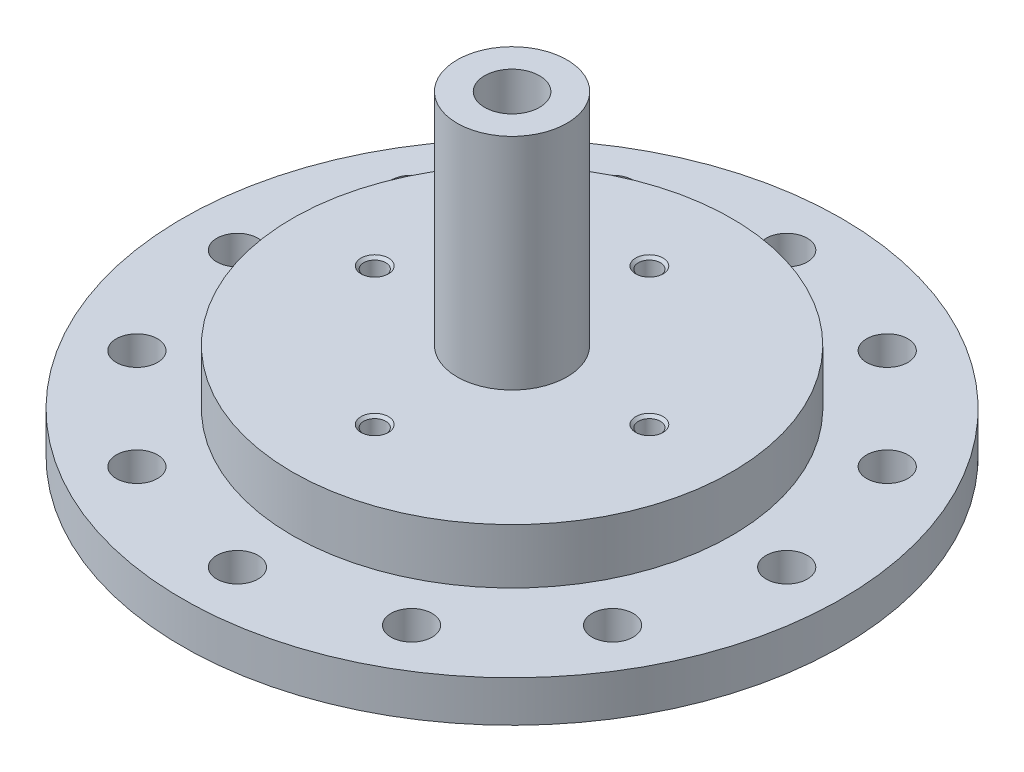
ISO-10303-21;
HEADER;
FILE_DESCRIPTION(('STEP AP214'),'2;1');
FILE_NAME('part.step','',(''),(''),'','','');
FILE_SCHEMA(('AUTOMOTIVE_DESIGN { 1 0 10303 214 1 1 1 1 }'));
ENDSEC;
DATA;
#1=APPLICATION_CONTEXT('core data for automotive mechanical design processes');
#2=APPLICATION_PROTOCOL_DEFINITION('international standard','automotive_design',2000,#1);
#3=PRODUCT_CONTEXT('',#1,'mechanical');
#4=PRODUCT('Part','Part','',(#3));
#5=PRODUCT_RELATED_PRODUCT_CATEGORY('part','',(#4));
#6=PRODUCT_DEFINITION_FORMATION('','',#4);
#7=PRODUCT_DEFINITION_CONTEXT('part definition',#1,'design');
#8=PRODUCT_DEFINITION('design','',#6,#7);
#9=PRODUCT_DEFINITION_SHAPE('','',#8);
#10=(LENGTH_UNIT() NAMED_UNIT(*) SI_UNIT(.MILLI.,.METRE.));
#11=(NAMED_UNIT(*) PLANE_ANGLE_UNIT() SI_UNIT($,.RADIAN.));
#12=(NAMED_UNIT(*) SI_UNIT($,.STERADIAN.) SOLID_ANGLE_UNIT());
#13=UNCERTAINTY_MEASURE_WITH_UNIT(LENGTH_MEASURE(1.E-05),#10,'distance_accuracy_value','');
#14=(GEOMETRIC_REPRESENTATION_CONTEXT(3) GLOBAL_UNCERTAINTY_ASSIGNED_CONTEXT((#13)) GLOBAL_UNIT_ASSIGNED_CONTEXT((#10,
#11,#12)) REPRESENTATION_CONTEXT('',''));
#15=CARTESIAN_POINT('',(0.,0.,0.));
#16=DIRECTION('',(0.,0.,1.));
#17=DIRECTION('',(1.,0.,0.));
#18=AXIS2_PLACEMENT_3D('',#15,#16,#17);
#19=CARTESIAN_POINT('',(0.,0.,0.));
#20=DIRECTION('',(0.,-1.,0.));
#21=DIRECTION('',(0.,0.,-1.));
#22=AXIS2_PLACEMENT_3D('',#19,#20,#21);
#23=PLANE('',#22);
#24=CARTESIAN_POINT('',(0.,0.,0.));
#25=DIRECTION('',(0.,-1.,0.));
#26=DIRECTION('',(0.,0.,-1.));
#27=AXIS2_PLACEMENT_3D('',#24,#25,#26);
#28=CIRCLE('',#27,25.4);
#29=CARTESIAN_POINT('',(0.,0.,-25.4));
#30=VERTEX_POINT('',#29);
#31=EDGE_CURVE('E400',#30,#30,#28,.T.);
#32=ORIENTED_EDGE('',*,*,#31,.F.);
#33=EDGE_LOOP('',(#32));
#34=FACE_BOUND('',#33,.T.);
#35=CARTESIAN_POINT('',(63.5,0.,0.));
#36=DIRECTION('',(0.,1.,0.));
#37=DIRECTION('',(0.,0.,1.));
#38=AXIS2_PLACEMENT_3D('',#35,#36,#37);
#39=CIRCLE('',#38,4.76249999999999);
#40=CARTESIAN_POINT('',(63.5,0.,4.76249999999999));
#41=VERTEX_POINT('',#40);
#42=EDGE_CURVE('E254',#41,#41,#39,.T.);
#43=ORIENTED_EDGE('',*,*,#42,.T.);
#44=EDGE_LOOP('',(#43));
#45=FACE_BOUND('',#44,.T.);
#46=CARTESIAN_POINT('',(54.9926131403117,0.,-31.7500000000002));
#47=DIRECTION('',(0.,1.,0.));
#48=DIRECTION('',(0.,0.,1.));
#49=AXIS2_PLACEMENT_3D('',#46,#47,#48);
#50=CIRCLE('',#49,4.76249999999999);
#51=CARTESIAN_POINT('',(54.9926131403117,0.,-26.9875000000003));
#52=VERTEX_POINT('',#51);
#53=EDGE_CURVE('E267',#52,#52,#50,.T.);
#54=ORIENTED_EDGE('',*,*,#53,.T.);
#55=EDGE_LOOP('',(#54));
#56=FACE_BOUND('',#55,.T.);
#57=CARTESIAN_POINT('',(31.7499999999997,0.,-54.9926131403119));
#58=DIRECTION('',(0.,1.,0.));
#59=DIRECTION('',(0.,0.,1.));
#60=AXIS2_PLACEMENT_3D('',#57,#58,#59);
#61=CIRCLE('',#60,4.76249999999999);
#62=CARTESIAN_POINT('',(31.7499999999997,0.,-50.2301131403119));
#63=VERTEX_POINT('',#62);
#64=EDGE_CURVE('E280',#63,#63,#61,.T.);
#65=ORIENTED_EDGE('',*,*,#64,.T.);
#66=EDGE_LOOP('',(#65));
#67=FACE_BOUND('',#66,.T.);
#68=CARTESIAN_POINT('',(0.,0.,63.5));
#69=DIRECTION('',(0.,1.,0.));
#70=DIRECTION('',(0.,0.,1.));
#71=AXIS2_PLACEMENT_3D('',#68,#69,#70);
#72=CIRCLE('',#71,4.76249999999999);
#73=CARTESIAN_POINT('',(0.,0.,68.2625));
#74=VERTEX_POINT('',#73);
#75=EDGE_CURVE('E291',#74,#74,#72,.T.);
#76=ORIENTED_EDGE('',*,*,#75,.T.);
#77=EDGE_LOOP('',(#76));
#78=FACE_BOUND('',#77,.T.);
#79=CARTESIAN_POINT('',(-31.75,0.,54.9926131403119));
#80=DIRECTION('',(0.,1.,0.));
#81=DIRECTION('',(0.,0.,1.));
#82=AXIS2_PLACEMENT_3D('',#79,#80,#81);
#83=CIRCLE('',#82,4.76249999999999);
#84=CARTESIAN_POINT('',(-31.75,0.,59.7551131403119));
#85=VERTEX_POINT('',#84);
#86=EDGE_CURVE('E200',#85,#85,#83,.T.);
#87=ORIENTED_EDGE('',*,*,#86,.T.);
#88=EDGE_LOOP('',(#87));
#89=FACE_BOUND('',#88,.T.);
#90=CARTESIAN_POINT('',(-54.9926131403117,0.,31.75));
#91=DIRECTION('',(0.,1.,0.));
#92=DIRECTION('',(0.,0.,1.));
#93=AXIS2_PLACEMENT_3D('',#90,#91,#92);
#94=CIRCLE('',#93,4.76249999999999);
#95=CARTESIAN_POINT('',(-54.9926131403117,0.,36.5125));
#96=VERTEX_POINT('',#95);
#97=EDGE_CURVE('E194',#96,#96,#94,.T.);
#98=ORIENTED_EDGE('',*,*,#97,.T.);
#99=EDGE_LOOP('',(#98));
#100=FACE_BOUND('',#99,.T.);
#101=CARTESIAN_POINT('',(31.75,0.,54.9926131403119));
#102=DIRECTION('',(0.,1.,0.));
#103=DIRECTION('',(0.,0.,1.));
#104=AXIS2_PLACEMENT_3D('',#101,#102,#103);
#105=CIRCLE('',#104,4.76249999999999);
#106=CARTESIAN_POINT('',(31.75,0.,59.7551131403119));
#107=VERTEX_POINT('',#106);
#108=EDGE_CURVE('E480',#107,#107,#105,.T.);
#109=ORIENTED_EDGE('',*,*,#108,.T.);
#110=EDGE_LOOP('',(#109));
#111=FACE_BOUND('',#110,.T.);
#112=CARTESIAN_POINT('',(54.9926131403119,0.,31.75));
#113=DIRECTION('',(0.,1.,0.));
#114=DIRECTION('',(0.,0.,1.));
#115=AXIS2_PLACEMENT_3D('',#112,#113,#114);
#116=CIRCLE('',#115,4.76249999999999);
#117=CARTESIAN_POINT('',(54.9926131403119,0.,36.5125));
#118=VERTEX_POINT('',#117);
#119=EDGE_CURVE('E476',#118,#118,#116,.T.);
#120=ORIENTED_EDGE('',*,*,#119,.T.);
#121=EDGE_LOOP('',(#120));
#122=FACE_BOUND('',#121,.T.);
#123=CARTESIAN_POINT('',(0.,0.,0.));
#124=DIRECTION('',(0.,-1.,0.));
#125=DIRECTION('',(0.,0.,-1.));
#126=AXIS2_PLACEMENT_3D('',#123,#124,#125);
#127=CIRCLE('',#126,76.2);
#128=CARTESIAN_POINT('',(0.,0.,-76.2));
#129=VERTEX_POINT('',#128);
#130=EDGE_CURVE('E229',#129,#129,#127,.T.);
#131=ORIENTED_EDGE('',*,*,#130,.T.);
#132=EDGE_LOOP('',(#131));
#133=FACE_BOUND('',#132,.T.);
#134=CARTESIAN_POINT('',(0.,0.,-63.5));
#135=DIRECTION('',(0.,1.,0.));
#136=DIRECTION('',(0.,0.,1.));
#137=AXIS2_PLACEMENT_3D('',#134,#135,#136);
#138=CIRCLE('',#137,4.76249999999999);
#139=CARTESIAN_POINT('',(0.,0.,-58.7375));
#140=VERTEX_POINT('',#139);
#141=EDGE_CURVE('E337',#140,#140,#138,.T.);
#142=ORIENTED_EDGE('',*,*,#141,.T.);
#143=EDGE_LOOP('',(#142));
#144=FACE_BOUND('',#143,.T.);
#145=CARTESIAN_POINT('',(-31.7500000000002,0.,-54.9926131403117));
#146=DIRECTION('',(0.,1.,0.));
#147=DIRECTION('',(0.,0.,1.));
#148=AXIS2_PLACEMENT_3D('',#145,#146,#147);
#149=CIRCLE('',#148,4.76249999999999);
#150=CARTESIAN_POINT('',(-31.7500000000002,0.,-50.2301131403117));
#151=VERTEX_POINT('',#150);
#152=EDGE_CURVE('E326',#151,#151,#149,.T.);
#153=ORIENTED_EDGE('',*,*,#152,.T.);
#154=EDGE_LOOP('',(#153));
#155=FACE_BOUND('',#154,.T.);
#156=CARTESIAN_POINT('',(-54.9926131403119,0.,-31.7499999999997));
#157=DIRECTION('',(0.,1.,0.));
#158=DIRECTION('',(0.,0.,1.));
#159=AXIS2_PLACEMENT_3D('',#156,#157,#158);
#160=CIRCLE('',#159,4.76249999999999);
#161=CARTESIAN_POINT('',(-54.9926131403119,0.,-26.9874999999998));
#162=VERTEX_POINT('',#161);
#163=EDGE_CURVE('E315',#162,#162,#160,.T.);
#164=ORIENTED_EDGE('',*,*,#163,.T.);
#165=EDGE_LOOP('',(#164));
#166=FACE_BOUND('',#165,.T.);
#167=CARTESIAN_POINT('',(-63.5,0.,0.));
#168=DIRECTION('',(0.,1.,0.));
#169=DIRECTION('',(0.,0.,1.));
#170=AXIS2_PLACEMENT_3D('',#167,#168,#169);
#171=CIRCLE('',#170,4.76249999999999);
#172=CARTESIAN_POINT('',(-63.5,0.,4.76249999999999));
#173=VERTEX_POINT('',#172);
#174=EDGE_CURVE('E305',#173,#173,#171,.T.);
#175=ORIENTED_EDGE('',*,*,#174,.T.);
#176=EDGE_LOOP('',(#175));
#177=FACE_BOUND('',#176,.T.);
#178=ADVANCED_FACE('F48',(#34,#45,#56,#67,#78,#89,#100,#111,#122,#133,#144,#155,#166,#177),#23,.T.);
#179=CARTESIAN_POINT('',(0.,9.525,0.));
#180=DIRECTION('',(0.,-1.,0.));
#181=DIRECTION('',(0.,0.,-1.));
#182=AXIS2_PLACEMENT_3D('',#179,#180,#181);
#183=CYLINDRICAL_SURFACE('',#182,76.2);
#184=CARTESIAN_POINT('',(0.,9.525,0.));
#185=DIRECTION('',(0.,-1.,0.));
#186=DIRECTION('',(0.,0.,-1.));
#187=AXIS2_PLACEMENT_3D('',#184,#185,#186);
#188=CIRCLE('',#187,76.2);
#189=CARTESIAN_POINT('',(0.,9.525,-76.2));
#190=VERTEX_POINT('',#189);
#191=EDGE_CURVE('E238',#190,#190,#188,.T.);
#192=ORIENTED_EDGE('',*,*,#191,.T.);
#193=EDGE_LOOP('',(#192));
#194=FACE_BOUND('',#193,.T.);
#195=ORIENTED_EDGE('',*,*,#130,.F.);
#196=EDGE_LOOP('',(#195));
#197=FACE_BOUND('',#196,.T.);
#198=ADVANCED_FACE('F132',(#194,#197),#183,.T.);
#199=CARTESIAN_POINT('',(76.2,9.525,0.));
#200=DIRECTION('',(0.,1.,0.));
#201=DIRECTION('',(0.,0.,1.));
#202=AXIS2_PLACEMENT_3D('',#199,#200,#201);
#203=PLANE('',#202);
#204=CARTESIAN_POINT('',(63.5,9.525,0.));
#205=DIRECTION('',(0.,1.,0.));
#206=DIRECTION('',(0.,0.,1.));
#207=AXIS2_PLACEMENT_3D('',#204,#205,#206);
#208=CIRCLE('',#207,4.76249999999999);
#209=CARTESIAN_POINT('',(63.5,9.525,4.76249999999999));
#210=VERTEX_POINT('',#209);
#211=EDGE_CURVE('E261',#210,#210,#208,.T.);
#212=ORIENTED_EDGE('',*,*,#211,.F.);
#213=EDGE_LOOP('',(#212));
#214=FACE_BOUND('',#213,.T.);
#215=CARTESIAN_POINT('',(54.9926131403117,9.525,-31.7500000000002));
#216=DIRECTION('',(0.,1.,0.));
#217=DIRECTION('',(0.,0.,1.));
#218=AXIS2_PLACEMENT_3D('',#215,#216,#217);
#219=CIRCLE('',#218,4.76249999999999);
#220=CARTESIAN_POINT('',(54.9926131403117,9.525,-26.9875000000003));
#221=VERTEX_POINT('',#220);
#222=EDGE_CURVE('E260',#221,#221,#219,.T.);
#223=ORIENTED_EDGE('',*,*,#222,.F.);
#224=EDGE_LOOP('',(#223));
#225=FACE_BOUND('',#224,.T.);
#226=CARTESIAN_POINT('',(31.7499999999997,9.525,-54.9926131403119));
#227=DIRECTION('',(0.,1.,0.));
#228=DIRECTION('',(0.,0.,1.));
#229=AXIS2_PLACEMENT_3D('',#226,#227,#228);
#230=CIRCLE('',#229,4.76249999999999);
#231=CARTESIAN_POINT('',(31.7499999999997,9.525,-50.2301131403119));
#232=VERTEX_POINT('',#231);
#233=EDGE_CURVE('E275',#232,#232,#230,.T.);
#234=ORIENTED_EDGE('',*,*,#233,.F.);
#235=EDGE_LOOP('',(#234));
#236=FACE_BOUND('',#235,.T.);
#237=CARTESIAN_POINT('',(0.,9.525,63.5));
#238=DIRECTION('',(0.,1.,0.));
#239=DIRECTION('',(0.,0.,1.));
#240=AXIS2_PLACEMENT_3D('',#237,#238,#239);
#241=CIRCLE('',#240,4.76249999999999);
#242=CARTESIAN_POINT('',(0.,9.525,68.2625));
#243=VERTEX_POINT('',#242);
#244=EDGE_CURVE('E284',#243,#243,#241,.T.);
#245=ORIENTED_EDGE('',*,*,#244,.F.);
#246=EDGE_LOOP('',(#245));
#247=FACE_BOUND('',#246,.T.);
#248=CARTESIAN_POINT('',(-31.75,9.525,54.9926131403119));
#249=DIRECTION('',(0.,1.,0.));
#250=DIRECTION('',(0.,0.,1.));
#251=AXIS2_PLACEMENT_3D('',#248,#249,#250);
#252=CIRCLE('',#251,4.76249999999999);
#253=CARTESIAN_POINT('',(-31.75,9.525,59.7551131403119));
#254=VERTEX_POINT('',#253);
#255=EDGE_CURVE('E209',#254,#254,#252,.T.);
#256=ORIENTED_EDGE('',*,*,#255,.F.);
#257=EDGE_LOOP('',(#256));
#258=FACE_BOUND('',#257,.T.);
#259=CARTESIAN_POINT('',(-54.9926131403117,9.525,31.75));
#260=DIRECTION('',(0.,1.,0.));
#261=DIRECTION('',(0.,0.,1.));
#262=AXIS2_PLACEMENT_3D('',#259,#260,#261);
#263=CIRCLE('',#262,4.76249999999999);
#264=CARTESIAN_POINT('',(-54.9926131403117,9.525,36.5125));
#265=VERTEX_POINT('',#264);
#266=EDGE_CURVE('E197',#265,#265,#263,.T.);
#267=ORIENTED_EDGE('',*,*,#266,.F.);
#268=EDGE_LOOP('',(#267));
#269=FACE_BOUND('',#268,.T.);
#270=CARTESIAN_POINT('',(-63.5,9.525,0.));
#271=DIRECTION('',(0.,1.,0.));
#272=DIRECTION('',(0.,0.,1.));
#273=AXIS2_PLACEMENT_3D('',#270,#271,#272);
#274=CIRCLE('',#273,4.76249999999999);
#275=CARTESIAN_POINT('',(-63.5,9.525,4.76249999999999));
#276=VERTEX_POINT('',#275);
#277=EDGE_CURVE('E205',#276,#276,#274,.T.);
#278=ORIENTED_EDGE('',*,*,#277,.F.);
#279=EDGE_LOOP('',(#278));
#280=FACE_BOUND('',#279,.T.);
#281=CARTESIAN_POINT('',(-54.9926131403119,9.525,-31.7499999999997));
#282=DIRECTION('',(0.,1.,0.));
#283=DIRECTION('',(0.,0.,1.));
#284=AXIS2_PLACEMENT_3D('',#281,#282,#283);
#285=CIRCLE('',#284,4.76249999999999);
#286=CARTESIAN_POINT('',(-54.9926131403119,9.525,-26.9874999999998));
#287=VERTEX_POINT('',#286);
#288=EDGE_CURVE('E310',#287,#287,#285,.T.);
#289=ORIENTED_EDGE('',*,*,#288,.F.);
#290=EDGE_LOOP('',(#289));
#291=FACE_BOUND('',#290,.T.);
#292=CARTESIAN_POINT('',(-31.7500000000002,9.525,-54.9926131403117));
#293=DIRECTION('',(0.,1.,0.));
#294=DIRECTION('',(0.,0.,1.));
#295=AXIS2_PLACEMENT_3D('',#292,#293,#294);
#296=CIRCLE('',#295,4.76249999999999);
#297=CARTESIAN_POINT('',(-31.7500000000002,9.525,-50.2301131403117));
#298=VERTEX_POINT('',#297);
#299=EDGE_CURVE('E321',#298,#298,#296,.T.);
#300=ORIENTED_EDGE('',*,*,#299,.F.);
#301=EDGE_LOOP('',(#300));
#302=FACE_BOUND('',#301,.T.);
#303=CARTESIAN_POINT('',(0.,9.525,-63.5));
#304=DIRECTION('',(0.,1.,0.));
#305=DIRECTION('',(0.,0.,1.));
#306=AXIS2_PLACEMENT_3D('',#303,#304,#305);
#307=CIRCLE('',#306,4.76249999999999);
#308=CARTESIAN_POINT('',(0.,9.525,-58.7375));
#309=VERTEX_POINT('',#308);
#310=EDGE_CURVE('E332',#309,#309,#307,.T.);
#311=ORIENTED_EDGE('',*,*,#310,.F.);
#312=EDGE_LOOP('',(#311));
#313=FACE_BOUND('',#312,.T.);
#314=CARTESIAN_POINT('',(31.75,9.525,54.9926131403119));
#315=DIRECTION('',(0.,1.,0.));
#316=DIRECTION('',(0.,0.,1.));
#317=AXIS2_PLACEMENT_3D('',#314,#315,#316);
#318=CIRCLE('',#317,4.76249999999999);
#319=CARTESIAN_POINT('',(31.75,9.525,59.7551131403119));
#320=VERTEX_POINT('',#319);
#321=EDGE_CURVE('E341',#320,#320,#318,.T.);
#322=ORIENTED_EDGE('',*,*,#321,.F.);
#323=EDGE_LOOP('',(#322));
#324=FACE_BOUND('',#323,.T.);
#325=CARTESIAN_POINT('',(54.9926131403119,9.525,31.75));
#326=DIRECTION('',(0.,1.,0.));
#327=DIRECTION('',(0.,0.,1.));
#328=AXIS2_PLACEMENT_3D('',#325,#326,#327);
#329=CIRCLE('',#328,4.76249999999999);
#330=CARTESIAN_POINT('',(54.9926131403119,9.525,36.5125));
#331=VERTEX_POINT('',#330);
#332=EDGE_CURVE('E479',#331,#331,#329,.T.);
#333=ORIENTED_EDGE('',*,*,#332,.F.);
#334=EDGE_LOOP('',(#333));
#335=FACE_BOUND('',#334,.T.);
#336=CARTESIAN_POINT('',(0.,9.525,0.));
#337=DIRECTION('',(0.,1.,0.));
#338=DIRECTION('',(0.,0.,1.));
#339=AXIS2_PLACEMENT_3D('',#336,#337,#338);
#340=CIRCLE('',#339,50.8);
#341=CARTESIAN_POINT('',(0.,9.525,50.8));
#342=VERTEX_POINT('',#341);
#343=EDGE_CURVE('E233',#342,#342,#340,.T.);
#344=ORIENTED_EDGE('',*,*,#343,.F.);
#345=EDGE_LOOP('',(#344));
#346=FACE_BOUND('',#345,.T.);
#347=ORIENTED_EDGE('',*,*,#191,.F.);
#348=EDGE_LOOP('',(#347));
#349=FACE_BOUND('',#348,.T.);
#350=ADVANCED_FACE('F138',(#214,#225,#236,#247,#258,#269,#280,#291,#302,#313,#324,#335,#346,
#349),#203,.T.);
#351=CARTESIAN_POINT('',(0.,22.225,0.));
#352=DIRECTION('',(0.,-1.,0.));
#353=DIRECTION('',(0.,0.,-1.));
#354=AXIS2_PLACEMENT_3D('',#351,#352,#353);
#355=CYLINDRICAL_SURFACE('',#354,50.8);
#356=CARTESIAN_POINT('',(0.,22.225,0.));
#357=DIRECTION('',(0.,1.,0.));
#358=DIRECTION('',(0.,0.,1.));
#359=AXIS2_PLACEMENT_3D('',#356,#357,#358);
#360=CIRCLE('',#359,50.8);
#361=CARTESIAN_POINT('',(0.,22.225,50.8));
#362=VERTEX_POINT('',#361);
#363=EDGE_CURVE('E224',#362,#362,#360,.T.);
#364=ORIENTED_EDGE('',*,*,#363,.F.);
#365=EDGE_LOOP('',(#364));
#366=FACE_BOUND('',#365,.T.);
#367=ORIENTED_EDGE('',*,*,#343,.T.);
#368=EDGE_LOOP('',(#367));
#369=FACE_BOUND('',#368,.T.);
#370=ADVANCED_FACE('F149',(#366,#369),#355,.T.);
#371=CARTESIAN_POINT('',(0.,22.225,0.));
#372=DIRECTION('',(0.,1.,0.));
#373=DIRECTION('',(0.,0.,1.));
#374=AXIS2_PLACEMENT_3D('',#371,#372,#373);
#375=PLANE('',#374);
#376=CARTESIAN_POINT('',(-31.75,22.225,0.));
#377=DIRECTION('',(0.,1.,0.));
#378=DIRECTION('',(0.,0.,1.));
#379=AXIS2_PLACEMENT_3D('',#376,#377,#378);
#380=CIRCLE('',#379,3.17499999940657);
#381=CARTESIAN_POINT('',(-31.75,22.225,3.17499999940657));
#382=VERTEX_POINT('',#381);
#383=EDGE_CURVE('E109',#382,#382,#380,.F.);
#384=ORIENTED_EDGE('',*,*,#383,.T.);
#385=EDGE_LOOP('',(#384));
#386=FACE_BOUND('',#385,.T.);
#387=CARTESIAN_POINT('',(0.,22.225,-31.75));
#388=DIRECTION('',(0.,1.,0.));
#389=DIRECTION('',(0.,0.,1.));
#390=AXIS2_PLACEMENT_3D('',#387,#388,#389);
#391=CIRCLE('',#390,3.17499999940654);
#392=CARTESIAN_POINT('',(0.,22.225,-28.5750000005935));
#393=VERTEX_POINT('',#392);
#394=EDGE_CURVE('E375',#393,#393,#391,.F.);
#395=ORIENTED_EDGE('',*,*,#394,.T.);
#396=EDGE_LOOP('',(#395));
#397=FACE_BOUND('',#396,.T.);
#398=CARTESIAN_POINT('',(31.75,22.225,0.));
#399=DIRECTION('',(0.,1.,0.));
#400=DIRECTION('',(0.,0.,1.));
#401=AXIS2_PLACEMENT_3D('',#398,#399,#400);
#402=CIRCLE('',#401,3.17499999940657);
#403=CARTESIAN_POINT('',(31.75,22.225,3.17499999940657));
#404=VERTEX_POINT('',#403);
#405=EDGE_CURVE('E372',#404,#404,#402,.F.);
#406=ORIENTED_EDGE('',*,*,#405,.T.);
#407=EDGE_LOOP('',(#406));
#408=FACE_BOUND('',#407,.T.);
#409=CARTESIAN_POINT('',(0.,22.225,31.75));
#410=DIRECTION('',(0.,1.,0.));
#411=DIRECTION('',(0.,0.,1.));
#412=AXIS2_PLACEMENT_3D('',#409,#410,#411);
#413=CIRCLE('',#412,3.17499999940654);
#414=CARTESIAN_POINT('',(0.,22.225,34.9249999994065));
#415=VERTEX_POINT('',#414);
#416=EDGE_CURVE('E368',#415,#415,#413,.F.);
#417=ORIENTED_EDGE('',*,*,#416,.T.);
#418=EDGE_LOOP('',(#417));
#419=FACE_BOUND('',#418,.T.);
#420=CARTESIAN_POINT('',(0.,22.225,0.));
#421=DIRECTION('',(0.,1.,0.));
#422=DIRECTION('',(0.,0.,1.));
#423=AXIS2_PLACEMENT_3D('',#420,#421,#422);
#424=CIRCLE('',#423,12.7);
#425=CARTESIAN_POINT('',(0.,22.225,12.7));
#426=VERTEX_POINT('',#425);
#427=EDGE_CURVE('E231',#426,#426,#424,.T.);
#428=ORIENTED_EDGE('',*,*,#427,.F.);
#429=EDGE_LOOP('',(#428));
#430=FACE_BOUND('',#429,.T.);
#431=ORIENTED_EDGE('',*,*,#363,.T.);
#432=EDGE_LOOP('',(#431));
#433=FACE_BOUND('',#432,.T.);
#434=ADVANCED_FACE('F385',(#386,#397,#408,#419,#430,#433),#375,.T.);
#435=CARTESIAN_POINT('',(0.,73.025,0.));
#436=DIRECTION('',(0.,-1.,0.));
#437=DIRECTION('',(0.,0.,-1.));
#438=AXIS2_PLACEMENT_3D('',#435,#436,#437);
#439=CYLINDRICAL_SURFACE('',#438,12.7);
#440=CARTESIAN_POINT('',(0.,73.025,0.));
#441=DIRECTION('',(0.,1.,0.));
#442=DIRECTION('',(0.,0.,1.));
#443=AXIS2_PLACEMENT_3D('',#440,#441,#442);
#444=CIRCLE('',#443,12.7);
#445=CARTESIAN_POINT('',(0.,73.025,12.7));
#446=VERTEX_POINT('',#445);
#447=EDGE_CURVE('E230',#446,#446,#444,.T.);
#448=ORIENTED_EDGE('',*,*,#447,.F.);
#449=EDGE_LOOP('',(#448));
#450=FACE_BOUND('',#449,.T.);
#451=ORIENTED_EDGE('',*,*,#427,.T.);
#452=EDGE_LOOP('',(#451));
#453=FACE_BOUND('',#452,.T.);
#454=ADVANCED_FACE('F537',(#450,#453),#439,.T.);
#455=CARTESIAN_POINT('',(0.,73.025,0.));
#456=DIRECTION('',(0.,1.,0.));
#457=DIRECTION('',(0.,0.,1.));
#458=AXIS2_PLACEMENT_3D('',#455,#456,#457);
#459=PLANE('',#458);
#460=CARTESIAN_POINT('',(0.,73.025,0.));
#461=DIRECTION('',(0.,-1.,0.));
#462=DIRECTION('',(0.,0.,-1.));
#463=AXIS2_PLACEMENT_3D('',#460,#461,#462);
#464=CIRCLE('',#463,6.34999999999999);
#465=CARTESIAN_POINT('',(0.,73.025,-6.34999999999999));
#466=VERTEX_POINT('',#465);
#467=EDGE_CURVE('E346',#466,#466,#464,.T.);
#468=ORIENTED_EDGE('',*,*,#467,.T.);
#469=EDGE_LOOP('',(#468));
#470=FACE_BOUND('',#469,.T.);
#471=ORIENTED_EDGE('',*,*,#447,.T.);
#472=EDGE_LOOP('',(#471));
#473=FACE_BOUND('',#472,.T.);
#474=ADVANCED_FACE('F527',(#470,#473),#459,.T.);
#475=CARTESIAN_POINT('',(54.9926131403119,9.525,31.75));
#476=DIRECTION('',(0.,1.,0.));
#477=DIRECTION('',(0.,0.,1.));
#478=AXIS2_PLACEMENT_3D('',#475,#476,#477);
#479=CYLINDRICAL_SURFACE('',#478,4.76249999999999);
#480=ORIENTED_EDGE('',*,*,#119,.F.);
#481=EDGE_LOOP('',(#480));
#482=FACE_BOUND('',#481,.T.);
#483=ORIENTED_EDGE('',*,*,#332,.T.);
#484=EDGE_LOOP('',(#483));
#485=FACE_BOUND('',#484,.T.);
#486=ADVANCED_FACE('F524',(#482,#485),#479,.F.);
#487=CARTESIAN_POINT('',(31.75,9.525,54.9926131403119));
#488=DIRECTION('',(0.,1.,0.));
#489=DIRECTION('',(0.,0.,1.));
#490=AXIS2_PLACEMENT_3D('',#487,#488,#489);
#491=CYLINDRICAL_SURFACE('',#490,4.76249999999999);
#492=ORIENTED_EDGE('',*,*,#108,.F.);
#493=EDGE_LOOP('',(#492));
#494=FACE_BOUND('',#493,.T.);
#495=ORIENTED_EDGE('',*,*,#321,.T.);
#496=EDGE_LOOP('',(#495));
#497=FACE_BOUND('',#496,.T.);
#498=ADVANCED_FACE('F526',(#494,#497),#491,.F.);
#499=CARTESIAN_POINT('',(0.,9.525,-63.5));
#500=DIRECTION('',(0.,1.,0.));
#501=DIRECTION('',(0.,0.,1.));
#502=AXIS2_PLACEMENT_3D('',#499,#500,#501);
#503=CYLINDRICAL_SURFACE('',#502,4.76249999999999);
#504=ORIENTED_EDGE('',*,*,#141,.F.);
#505=EDGE_LOOP('',(#504));
#506=FACE_BOUND('',#505,.T.);
#507=ORIENTED_EDGE('',*,*,#310,.T.);
#508=EDGE_LOOP('',(#507));
#509=FACE_BOUND('',#508,.T.);
#510=ADVANCED_FACE('F534',(#506,#509),#503,.F.);
#511=CARTESIAN_POINT('',(-31.7500000000002,9.525,-54.9926131403117));
#512=DIRECTION('',(0.,1.,0.));
#513=DIRECTION('',(0.,0.,1.));
#514=AXIS2_PLACEMENT_3D('',#511,#512,#513);
#515=CYLINDRICAL_SURFACE('',#514,4.76249999999999);
#516=ORIENTED_EDGE('',*,*,#152,.F.);
#517=EDGE_LOOP('',(#516));
#518=FACE_BOUND('',#517,.T.);
#519=ORIENTED_EDGE('',*,*,#299,.T.);
#520=EDGE_LOOP('',(#519));
#521=FACE_BOUND('',#520,.T.);
#522=ADVANCED_FACE('F744',(#518,#521),#515,.F.);
#523=CARTESIAN_POINT('',(-54.9926131403119,9.525,-31.7499999999997));
#524=DIRECTION('',(0.,1.,0.));
#525=DIRECTION('',(0.,0.,1.));
#526=AXIS2_PLACEMENT_3D('',#523,#524,#525);
#527=CYLINDRICAL_SURFACE('',#526,4.76249999999999);
#528=ORIENTED_EDGE('',*,*,#163,.F.);
#529=EDGE_LOOP('',(#528));
#530=FACE_BOUND('',#529,.T.);
#531=ORIENTED_EDGE('',*,*,#288,.T.);
#532=EDGE_LOOP('',(#531));
#533=FACE_BOUND('',#532,.T.);
#534=ADVANCED_FACE('F171',(#530,#533),#527,.F.);
#535=CARTESIAN_POINT('',(-63.5,9.525,0.));
#536=DIRECTION('',(0.,1.,0.));
#537=DIRECTION('',(0.,0.,1.));
#538=AXIS2_PLACEMENT_3D('',#535,#536,#537);
#539=CYLINDRICAL_SURFACE('',#538,4.76249999999999);
#540=ORIENTED_EDGE('',*,*,#174,.F.);
#541=EDGE_LOOP('',(#540));
#542=FACE_BOUND('',#541,.T.);
#543=ORIENTED_EDGE('',*,*,#277,.T.);
#544=EDGE_LOOP('',(#543));
#545=FACE_BOUND('',#544,.T.);
#546=ADVANCED_FACE('F175',(#542,#545),#539,.F.);
#547=CARTESIAN_POINT('',(-54.9926131403117,9.525,31.75));
#548=DIRECTION('',(0.,1.,0.));
#549=DIRECTION('',(0.,0.,1.));
#550=AXIS2_PLACEMENT_3D('',#547,#548,#549);
#551=CYLINDRICAL_SURFACE('',#550,4.76249999999999);
#552=ORIENTED_EDGE('',*,*,#97,.F.);
#553=EDGE_LOOP('',(#552));
#554=FACE_BOUND('',#553,.T.);
#555=ORIENTED_EDGE('',*,*,#266,.T.);
#556=EDGE_LOOP('',(#555));
#557=FACE_BOUND('',#556,.T.);
#558=ADVANCED_FACE('F181',(#554,#557),#551,.F.);
#559=CARTESIAN_POINT('',(-31.75,9.525,54.9926131403119));
#560=DIRECTION('',(0.,1.,0.));
#561=DIRECTION('',(0.,0.,1.));
#562=AXIS2_PLACEMENT_3D('',#559,#560,#561);
#563=CYLINDRICAL_SURFACE('',#562,4.76249999999999);
#564=ORIENTED_EDGE('',*,*,#86,.F.);
#565=EDGE_LOOP('',(#564));
#566=FACE_BOUND('',#565,.T.);
#567=ORIENTED_EDGE('',*,*,#255,.T.);
#568=EDGE_LOOP('',(#567));
#569=FACE_BOUND('',#568,.T.);
#570=ADVANCED_FACE('F179',(#566,#569),#563,.F.);
#571=CARTESIAN_POINT('',(0.,9.525,63.5));
#572=DIRECTION('',(0.,1.,0.));
#573=DIRECTION('',(0.,0.,1.));
#574=AXIS2_PLACEMENT_3D('',#571,#572,#573);
#575=CYLINDRICAL_SURFACE('',#574,4.76249999999999);
#576=ORIENTED_EDGE('',*,*,#75,.F.);
#577=EDGE_LOOP('',(#576));
#578=FACE_BOUND('',#577,.T.);
#579=ORIENTED_EDGE('',*,*,#244,.T.);
#580=EDGE_LOOP('',(#579));
#581=FACE_BOUND('',#580,.T.);
#582=ADVANCED_FACE('F188',(#578,#581),#575,.F.);
#583=CARTESIAN_POINT('',(31.7499999999997,9.525,-54.9926131403119));
#584=DIRECTION('',(0.,1.,0.));
#585=DIRECTION('',(0.,0.,1.));
#586=AXIS2_PLACEMENT_3D('',#583,#584,#585);
#587=CYLINDRICAL_SURFACE('',#586,4.76249999999999);
#588=ORIENTED_EDGE('',*,*,#64,.F.);
#589=EDGE_LOOP('',(#588));
#590=FACE_BOUND('',#589,.T.);
#591=ORIENTED_EDGE('',*,*,#233,.T.);
#592=EDGE_LOOP('',(#591));
#593=FACE_BOUND('',#592,.T.);
#594=ADVANCED_FACE('F454',(#590,#593),#587,.F.);
#595=CARTESIAN_POINT('',(54.9926131403117,9.525,-31.7500000000002));
#596=DIRECTION('',(0.,1.,0.));
#597=DIRECTION('',(0.,0.,1.));
#598=AXIS2_PLACEMENT_3D('',#595,#596,#597);
#599=CYLINDRICAL_SURFACE('',#598,4.76249999999999);
#600=ORIENTED_EDGE('',*,*,#53,.F.);
#601=EDGE_LOOP('',(#600));
#602=FACE_BOUND('',#601,.T.);
#603=ORIENTED_EDGE('',*,*,#222,.T.);
#604=EDGE_LOOP('',(#603));
#605=FACE_BOUND('',#604,.T.);
#606=ADVANCED_FACE('F450',(#602,#605),#599,.F.);
#607=CARTESIAN_POINT('',(63.5,9.525,0.));
#608=DIRECTION('',(0.,1.,0.));
#609=DIRECTION('',(0.,0.,1.));
#610=AXIS2_PLACEMENT_3D('',#607,#608,#609);
#611=CYLINDRICAL_SURFACE('',#610,4.76249999999999);
#612=ORIENTED_EDGE('',*,*,#42,.F.);
#613=EDGE_LOOP('',(#612));
#614=FACE_BOUND('',#613,.T.);
#615=ORIENTED_EDGE('',*,*,#211,.T.);
#616=EDGE_LOOP('',(#615));
#617=FACE_BOUND('',#616,.T.);
#618=ADVANCED_FACE('F445',(#614,#617),#611,.F.);
#619=CARTESIAN_POINT('',(0.,0.,0.));
#620=DIRECTION('',(0.,-1.,0.));
#621=DIRECTION('',(0.,0.,-1.));
#622=AXIS2_PLACEMENT_3D('',#619,#620,#621);
#623=CYLINDRICAL_SURFACE('',#622,6.35);
#624=ORIENTED_EDGE('',*,*,#467,.F.);
#625=EDGE_LOOP('',(#624));
#626=FACE_BOUND('',#625,.T.);
#627=CARTESIAN_POINT('',(0.,3.175,0.));
#628=DIRECTION('',(0.,-1.,0.));
#629=DIRECTION('',(0.,0.,-1.));
#630=AXIS2_PLACEMENT_3D('',#627,#628,#629);
#631=CIRCLE('',#630,6.35000000000001);
#632=CARTESIAN_POINT('',(0.,3.175,-6.35000000000001));
#633=VERTEX_POINT('',#632);
#634=EDGE_CURVE('E351',#633,#633,#631,.T.);
#635=ORIENTED_EDGE('',*,*,#634,.T.);
#636=EDGE_LOOP('',(#635));
#637=FACE_BOUND('',#636,.T.);
#638=ADVANCED_FACE('F438',(#626,#637),#623,.F.);
#639=CARTESIAN_POINT('',(6.35000000000001,3.175,0.));
#640=DIRECTION('',(0.,1.,0.));
#641=DIRECTION('',(0.,0.,1.));
#642=AXIS2_PLACEMENT_3D('',#639,#640,#641);
#643=PLANE('',#642);
#644=ORIENTED_EDGE('',*,*,#634,.F.);
#645=EDGE_LOOP('',(#644));
#646=FACE_BOUND('',#645,.T.);
#647=CARTESIAN_POINT('',(0.,3.175,0.));
#648=DIRECTION('',(0.,-1.,0.));
#649=DIRECTION('',(0.,0.,-1.));
#650=AXIS2_PLACEMENT_3D('',#647,#648,#649);
#651=CIRCLE('',#650,25.4);
#652=CARTESIAN_POINT('',(0.,3.175,-25.4));
#653=VERTEX_POINT('',#652);
#654=EDGE_CURVE('E356',#653,#653,#651,.T.);
#655=ORIENTED_EDGE('',*,*,#654,.T.);
#656=EDGE_LOOP('',(#655));
#657=FACE_BOUND('',#656,.T.);
#658=ADVANCED_FACE('F434',(#646,#657),#643,.F.);
#659=CARTESIAN_POINT('',(0.,0.,0.));
#660=DIRECTION('',(0.,-1.,0.));
#661=DIRECTION('',(0.,0.,-1.));
#662=AXIS2_PLACEMENT_3D('',#659,#660,#661);
#663=CYLINDRICAL_SURFACE('',#662,25.4);
#664=ORIENTED_EDGE('',*,*,#654,.F.);
#665=EDGE_LOOP('',(#664));
#666=FACE_BOUND('',#665,.T.);
#667=ORIENTED_EDGE('',*,*,#31,.T.);
#668=EDGE_LOOP('',(#667));
#669=FACE_BOUND('',#668,.T.);
#670=ADVANCED_FACE('F431',(#666,#669),#663,.F.);
#671=CARTESIAN_POINT('',(-31.75,9.525,0.));
#672=DIRECTION('',(0.,1.,0.));
#673=DIRECTION('',(0.,0.,1.));
#674=AXIS2_PLACEMENT_3D('',#671,#672,#673);
#675=CONICAL_SURFACE('',#674,2.55269999999999,1.02974425745405);
#676=CARTESIAN_POINT('',(-31.75,7.99118309356066,0.));
#677=VERTEX_POINT('',#676);
#678=VERTEX_LOOP('',#677);
#679=FACE_BOUND('',#678,.T.);
#680=CARTESIAN_POINT('',(-31.75,9.525,0.));
#681=DIRECTION('',(0.,1.,0.));
#682=DIRECTION('',(0.,0.,1.));
#683=AXIS2_PLACEMENT_3D('',#680,#681,#682);
#684=CIRCLE('',#683,2.55269999999999);
#685=CARTESIAN_POINT('',(-31.75,9.525,2.55269999999999));
#686=VERTEX_POINT('',#685);
#687=EDGE_CURVE('E397',#686,#686,#684,.T.);
#688=ORIENTED_EDGE('',*,*,#687,.T.);
#689=EDGE_LOOP('',(#688));
#690=FACE_BOUND('',#689,.T.);
#691=ADVANCED_FACE('F393',(#679,#690),#675,.F.);
#692=CARTESIAN_POINT('',(-31.75,22.225,0.));
#693=DIRECTION('',(0.,1.,0.));
#694=DIRECTION('',(0.,0.,1.));
#695=AXIS2_PLACEMENT_3D('',#692,#693,#694);
#696=CYLINDRICAL_SURFACE('',#695,2.55269999999999);
#697=CARTESIAN_POINT('',(-31.75,21.6026999994566,0.));
#698=DIRECTION('',(0.,1.,0.));
#699=DIRECTION('',(0.,0.,1.));
#700=AXIS2_PLACEMENT_3D('',#697,#698,#699);
#701=CIRCLE('',#700,2.55269999999999);
#702=CARTESIAN_POINT('',(-31.75,21.6026999994566,2.55269999999999));
#703=VERTEX_POINT('',#702);
#704=EDGE_CURVE('E363',#703,#703,#701,.T.);
#705=ORIENTED_EDGE('',*,*,#704,.T.);
#706=EDGE_LOOP('',(#705));
#707=FACE_BOUND('',#706,.T.);
#708=ORIENTED_EDGE('',*,*,#687,.F.);
#709=EDGE_LOOP('',(#708));
#710=FACE_BOUND('',#709,.T.);
#711=ADVANCED_FACE('F389',(#707,#710),#696,.F.);
#712=CARTESIAN_POINT('',(0.,9.525,-31.75));
#713=DIRECTION('',(0.,1.,0.));
#714=DIRECTION('',(0.,0.,1.));
#715=AXIS2_PLACEMENT_3D('',#712,#713,#714);
#716=CONICAL_SURFACE('',#715,2.55269999999999,1.02974425745405);
#717=CARTESIAN_POINT('',(0.,7.99118309356066,-31.75));
#718=VERTEX_POINT('',#717);
#719=VERTEX_LOOP('',#718);
#720=FACE_BOUND('',#719,.T.);
#721=CARTESIAN_POINT('',(0.,9.525,-31.75));
#722=DIRECTION('',(0.,1.,0.));
#723=DIRECTION('',(0.,0.,1.));
#724=AXIS2_PLACEMENT_3D('',#721,#722,#723);
#725=CIRCLE('',#724,2.55269999999999);
#726=CARTESIAN_POINT('',(0.,9.525,-29.1973));
#727=VERTEX_POINT('',#726);
#728=EDGE_CURVE('E92',#727,#727,#725,.T.);
#729=ORIENTED_EDGE('',*,*,#728,.T.);
#730=EDGE_LOOP('',(#729));
#731=FACE_BOUND('',#730,.T.);
#732=ADVANCED_FACE('F392',(#720,#731),#716,.F.);
#733=CARTESIAN_POINT('',(0.,22.225,-31.75));
#734=DIRECTION('',(0.,1.,0.));
#735=DIRECTION('',(0.,0.,1.));
#736=AXIS2_PLACEMENT_3D('',#733,#734,#735);
#737=CYLINDRICAL_SURFACE('',#736,2.55269999999999);
#738=CARTESIAN_POINT('',(0.,21.6026999994566,-31.75));
#739=DIRECTION('',(0.,1.,0.));
#740=DIRECTION('',(0.,0.,1.));
#741=AXIS2_PLACEMENT_3D('',#738,#739,#740);
#742=CIRCLE('',#741,2.55269999999999);
#743=CARTESIAN_POINT('',(0.,21.6026999994566,-29.1973));
#744=VERTEX_POINT('',#743);
#745=EDGE_CURVE('E104',#744,#744,#742,.T.);
#746=ORIENTED_EDGE('',*,*,#745,.T.);
#747=EDGE_LOOP('',(#746));
#748=FACE_BOUND('',#747,.T.);
#749=ORIENTED_EDGE('',*,*,#728,.F.);
#750=EDGE_LOOP('',(#749));
#751=FACE_BOUND('',#750,.T.);
#752=ADVANCED_FACE('F412',(#748,#751),#737,.F.);
#753=CARTESIAN_POINT('',(0.,9.525,31.75));
#754=DIRECTION('',(0.,1.,0.));
#755=DIRECTION('',(0.,0.,1.));
#756=AXIS2_PLACEMENT_3D('',#753,#754,#755);
#757=CONICAL_SURFACE('',#756,2.55269999999999,1.02974425745405);
#758=CARTESIAN_POINT('',(0.,7.99118309356066,31.75));
#759=VERTEX_POINT('',#758);
#760=VERTEX_LOOP('',#759);
#761=FACE_BOUND('',#760,.T.);
#762=CARTESIAN_POINT('',(0.,9.525,31.75));
#763=DIRECTION('',(0.,1.,0.));
#764=DIRECTION('',(0.,0.,1.));
#765=AXIS2_PLACEMENT_3D('',#762,#763,#764);
#766=CIRCLE('',#765,2.55269999999999);
#767=CARTESIAN_POINT('',(0.,9.525,34.3027));
#768=VERTEX_POINT('',#767);
#769=EDGE_CURVE('E87',#768,#768,#766,.T.);
#770=ORIENTED_EDGE('',*,*,#769,.T.);
#771=EDGE_LOOP('',(#770));
#772=FACE_BOUND('',#771,.T.);
#773=ADVANCED_FACE('F414',(#761,#772),#757,.F.);
#774=CARTESIAN_POINT('',(0.,22.225,31.75));
#775=DIRECTION('',(0.,1.,0.));
#776=DIRECTION('',(0.,0.,1.));
#777=AXIS2_PLACEMENT_3D('',#774,#775,#776);
#778=CYLINDRICAL_SURFACE('',#777,2.55269999999999);
#779=CARTESIAN_POINT('',(0.,21.6026999994566,31.75));
#780=DIRECTION('',(0.,1.,0.));
#781=DIRECTION('',(0.,0.,1.));
#782=AXIS2_PLACEMENT_3D('',#779,#780,#781);
#783=CIRCLE('',#782,2.55269999999999);
#784=CARTESIAN_POINT('',(0.,21.6026999994566,34.3027));
#785=VERTEX_POINT('',#784);
#786=EDGE_CURVE('E12',#785,#785,#783,.T.);
#787=ORIENTED_EDGE('',*,*,#786,.T.);
#788=EDGE_LOOP('',(#787));
#789=FACE_BOUND('',#788,.T.);
#790=ORIENTED_EDGE('',*,*,#769,.F.);
#791=EDGE_LOOP('',(#790));
#792=FACE_BOUND('',#791,.T.);
#793=ADVANCED_FACE('F80',(#789,#792),#778,.F.);
#794=CARTESIAN_POINT('',(31.75,9.525,0.));
#795=DIRECTION('',(0.,1.,0.));
#796=DIRECTION('',(0.,0.,1.));
#797=AXIS2_PLACEMENT_3D('',#794,#795,#796);
#798=CONICAL_SURFACE('',#797,2.55269999999999,1.02974425745405);
#799=CARTESIAN_POINT('',(31.75,7.99118309356066,0.));
#800=VERTEX_POINT('',#799);
#801=VERTEX_LOOP('',#800);
#802=FACE_BOUND('',#801,.T.);
#803=CARTESIAN_POINT('',(31.75,9.525,0.));
#804=DIRECTION('',(0.,1.,0.));
#805=DIRECTION('',(0.,0.,1.));
#806=AXIS2_PLACEMENT_3D('',#803,#804,#805);
#807=CIRCLE('',#806,2.55269999999999);
#808=CARTESIAN_POINT('',(31.75,9.525,2.55269999999999));
#809=VERTEX_POINT('',#808);
#810=EDGE_CURVE('E84',#809,#809,#807,.T.);
#811=ORIENTED_EDGE('',*,*,#810,.T.);
#812=EDGE_LOOP('',(#811));
#813=FACE_BOUND('',#812,.T.);
#814=ADVANCED_FACE('F76',(#802,#813),#798,.F.);
#815=CARTESIAN_POINT('',(31.75,22.225,0.));
#816=DIRECTION('',(0.,1.,0.));
#817=DIRECTION('',(0.,0.,1.));
#818=AXIS2_PLACEMENT_3D('',#815,#816,#817);
#819=CYLINDRICAL_SURFACE('',#818,2.55269999999999);
#820=CARTESIAN_POINT('',(31.75,21.6026999994566,0.));
#821=DIRECTION('',(0.,1.,0.));
#822=DIRECTION('',(0.,0.,1.));
#823=AXIS2_PLACEMENT_3D('',#820,#821,#822);
#824=CIRCLE('',#823,2.55269999999999);
#825=CARTESIAN_POINT('',(31.75,21.6026999994566,2.55269999999999));
#826=VERTEX_POINT('',#825);
#827=EDGE_CURVE('E59',#826,#826,#824,.T.);
#828=ORIENTED_EDGE('',*,*,#827,.T.);
#829=EDGE_LOOP('',(#828));
#830=FACE_BOUND('',#829,.T.);
#831=ORIENTED_EDGE('',*,*,#810,.F.);
#832=EDGE_LOOP('',(#831));
#833=FACE_BOUND('',#832,.T.);
#834=ADVANCED_FACE('F79',(#830,#833),#819,.F.);
#835=CARTESIAN_POINT('',(-31.75,21.6026999994566,0.));
#836=DIRECTION('',(0.,1.,0.));
#837=DIRECTION('',(0.,0.,1.));
#838=AXIS2_PLACEMENT_3D('',#835,#836,#837);
#839=CONICAL_SURFACE('',#838,2.55269999999999,0.78539816248402);
#840=CARTESIAN_POINT('',(-31.75,22.225,3.17499999940657));
#841=CARTESIAN_POINT('',(-31.75,22.2185177083277,3.16851770774608));
#842=CARTESIAN_POINT('',(-31.75,22.2120354166553,3.1620354160856));
#843=CARTESIAN_POINT('',(-31.75,22.1990708333107,3.14907083276463));
#844=CARTESIAN_POINT('',(-31.75,22.1925885416384,3.14258854110414));
#845=CARTESIAN_POINT('',(-31.75,22.1796239582937,3.12962395778317));
#846=CARTESIAN_POINT('',(-31.75,22.1731416666214,3.12314166612269));
#847=CARTESIAN_POINT('',(-31.75,22.1601770832767,3.11017708280172));
#848=CARTESIAN_POINT('',(-31.75,22.1536947916044,3.10369479114123));
#849=CARTESIAN_POINT('',(-31.75,22.1407302082597,3.09073020782026));
#850=CARTESIAN_POINT('',(-31.75,22.1342479165874,3.08424791615977));
#851=CARTESIAN_POINT('',(-31.75,22.1212833332428,3.0712833328388));
#852=CARTESIAN_POINT('',(-31.75,22.1148010415704,3.06480104117832));
#853=CARTESIAN_POINT('',(-31.75,22.1018364582258,3.05183645785735));
#854=CARTESIAN_POINT('',(-31.75,22.0953541665534,3.04535416619686));
#855=CARTESIAN_POINT('',(-31.75,22.0823895832088,3.03238958287589));
#856=CARTESIAN_POINT('',(-31.75,22.0759072915365,3.02590729121541));
#857=CARTESIAN_POINT('',(-31.75,22.0629427081918,3.01294270789444));
#858=CARTESIAN_POINT('',(-31.75,22.0564604165195,3.00646041623395));
#859=CARTESIAN_POINT('',(-31.75,22.0434958331748,2.99349583291298));
#860=CARTESIAN_POINT('',(-31.75,22.0370135415025,2.9870135412525));
#861=CARTESIAN_POINT('',(-31.75,22.0240489581578,2.97404895793153));
#862=CARTESIAN_POINT('',(-31.75,22.0175666664855,2.96756666627104));
#863=CARTESIAN_POINT('',(-31.75,22.0046020831409,2.95460208295007));
#864=CARTESIAN_POINT('',(-31.75,21.9981197914685,2.94811979128959));
#865=CARTESIAN_POINT('',(-31.75,21.9851552081239,2.93515520796862));
#866=CARTESIAN_POINT('',(-31.75,21.9786729164516,2.92867291630813));
#867=CARTESIAN_POINT('',(-31.75,21.9657083331069,2.91570833298716));
#868=CARTESIAN_POINT('',(-31.75,21.9592260414346,2.90922604132667));
#869=CARTESIAN_POINT('',(-31.75,21.9462614580899,2.8962614580057));
#870=CARTESIAN_POINT('',(-31.75,21.9397791664176,2.88977916634522));
#871=CARTESIAN_POINT('',(-31.75,21.9268145830729,2.87681458302425));
#872=CARTESIAN_POINT('',(-31.75,21.9203322914006,2.87033229136376));
#873=CARTESIAN_POINT('',(-31.75,21.907367708056,2.85736770804279));
#874=CARTESIAN_POINT('',(-31.75,21.9008854163836,2.85088541638231));
#875=CARTESIAN_POINT('',(-31.75,21.887920833039,2.83792083306134));
#876=CARTESIAN_POINT('',(-31.75,21.8814385413666,2.83143854140085));
#877=CARTESIAN_POINT('',(-31.75,21.868473958022,2.81847395807988));
#878=CARTESIAN_POINT('',(-31.75,21.8619916663497,2.8119916664194));
#879=CARTESIAN_POINT('',(-31.75,21.849027083005,2.79902708309843));
#880=CARTESIAN_POINT('',(-31.75,21.8425447913327,2.79254479143794));
#881=CARTESIAN_POINT('',(-31.75,21.829580207988,2.77958020811697));
#882=CARTESIAN_POINT('',(-31.75,21.8230979163157,2.77309791645648));
#883=CARTESIAN_POINT('',(-31.75,21.810133332971,2.76013333313551));
#884=CARTESIAN_POINT('',(-31.75,21.8036510412987,2.75365104147503));
#885=CARTESIAN_POINT('',(-31.75,21.7906864579541,2.74068645815406));
#886=CARTESIAN_POINT('',(-31.75,21.7842041662817,2.73420416649357));
#887=CARTESIAN_POINT('',(-31.75,21.7712395829371,2.7212395831726));
#888=CARTESIAN_POINT('',(-31.75,21.7647572912648,2.71475729151212));
#889=CARTESIAN_POINT('',(-31.75,21.7517927079201,2.70179270819115));
#890=CARTESIAN_POINT('',(-31.75,21.7453104162478,2.69531041653066));
#891=CARTESIAN_POINT('',(-31.75,21.7323458329031,2.68234583320969));
#892=CARTESIAN_POINT('',(-31.75,21.7258635412308,2.67586354154921));
#893=CARTESIAN_POINT('',(-31.75,21.7128989578861,2.66289895822824));
#894=CARTESIAN_POINT('',(-31.75,21.7064166662138,2.65641666656775));
#895=CARTESIAN_POINT('',(-31.75,21.6934520828691,2.64345208324678));
#896=CARTESIAN_POINT('',(-31.75,21.6869697911968,2.63696979158629));
#897=CARTESIAN_POINT('',(-31.75,21.6740052078522,2.62400520826532));
#898=CARTESIAN_POINT('',(-31.75,21.6675229161798,2.61752291660484));
#899=CARTESIAN_POINT('',(-31.75,21.6545583328352,2.60455833328387));
#900=CARTESIAN_POINT('',(-31.75,21.6480760411629,2.59807604162338));
#901=CARTESIAN_POINT('',(-31.75,21.6351114578182,2.58511145830241));
#902=CARTESIAN_POINT('',(-31.75,21.6286291661459,2.57862916664193));
#903=CARTESIAN_POINT('',(-31.75,21.6156645828012,2.56566458332096));
#904=CARTESIAN_POINT('',(-31.75,21.6091822911289,2.55918229166047));
#905=CARTESIAN_POINT('',(-31.75,21.6026999994566,2.55269999999999));
#906=B_SPLINE_CURVE_WITH_KNOTS('',3,(#840,#841,#842,#843,#844,#845,#846,#847,#848,#849,#850,
#851,#852,#853,#854,#855,#856,#857,#858,#859,#860,#861,#862,#863,#864,#865,#866,#867,#868,#869,
#870,#871,#872,#873,#874,#875,#876,#877,#878,#879,#880,#881,#882,#883,#884,#885,#886,#887,#888,
#889,#890,#891,#892,#893,#894,#895,#896,#897,#898,#899,#900,#901,#902,#903,#904,#905),
.UNSPECIFIED.,.F.,.F.,(4,2,2,2,2,2,2,2,2,2,2,2,2,2,2,2,2,2,2,2,2,2,2,2,2,2,2,2,2,2,2,2,4),(0.,
0.0275020343696718,0.0550040687393412,0.0825061031090105,0.11000813747868,0.137510171848349,
0.165012206218019,0.192514240587688,0.220016274957358,0.247518309327029,0.275020343696699,
0.302522378066368,0.330024412436038,0.357526446805707,0.385028481175377,0.412530515545046,
0.440032549914715,0.467534584284387,0.495036618654057,0.522538653023726,0.550040687393395,
0.577542721763064,0.605044756132734,0.632546790502403,0.660048824872073,0.687550859241745,
0.715052893611414,0.742554927981083,0.770056962350753,0.797558996720422,0.825061031090092,
0.852563065459761,0.88006509982943),.UNSPECIFIED.);
#907=EDGE_CURVE('BSEAM126',#382,#703,#906,.T.);
#908=ORIENTED_EDGE('',*,*,#383,.F.);
#909=ORIENTED_EDGE('',*,*,#704,.F.);
#910=ORIENTED_EDGE('',*,*,#907,.T.);
#911=ORIENTED_EDGE('',*,*,#907,.F.);
#912=EDGE_LOOP('',(#908,#910,#909,#911));
#913=FACE_BOUND('',#912,.T.);
#914=ADVANCED_FACE('F126',(#913),#839,.F.);
#915=CARTESIAN_POINT('',(0.,21.6026999994566,-31.75));
#916=DIRECTION('',(0.,1.,0.));
#917=DIRECTION('',(0.,0.,1.));
#918=AXIS2_PLACEMENT_3D('',#915,#916,#917);
#919=CONICAL_SURFACE('',#918,2.55269999999999,0.785398162484021);
#920=ORIENTED_EDGE('',*,*,#394,.F.);
#921=EDGE_LOOP('',(#920));
#922=FACE_BOUND('',#921,.T.);
#923=ORIENTED_EDGE('',*,*,#745,.F.);
#924=EDGE_LOOP('',(#923));
#925=FACE_BOUND('',#924,.T.);
#926=ADVANCED_FACE('F119',(#922,#925),#919,.F.);
#927=CARTESIAN_POINT('',(31.75,21.6026999994566,0.));
#928=DIRECTION('',(0.,1.,0.));
#929=DIRECTION('',(0.,0.,1.));
#930=AXIS2_PLACEMENT_3D('',#927,#928,#929);
#931=CONICAL_SURFACE('',#930,2.55269999999999,0.785398162484019);
#932=CARTESIAN_POINT('',(31.75,22.225,3.17499999940657));
#933=CARTESIAN_POINT('',(31.75,22.2185177083277,3.16851770774608));
#934=CARTESIAN_POINT('',(31.75,22.2120354166553,3.1620354160856));
#935=CARTESIAN_POINT('',(31.75,22.1990708333107,3.14907083276463));
#936=CARTESIAN_POINT('',(31.75,22.1925885416384,3.14258854110414));
#937=CARTESIAN_POINT('',(31.75,22.1796239582937,3.12962395778317));
#938=CARTESIAN_POINT('',(31.75,22.1731416666214,3.12314166612269));
#939=CARTESIAN_POINT('',(31.75,22.1601770832767,3.11017708280172));
#940=CARTESIAN_POINT('',(31.75,22.1536947916044,3.10369479114123));
#941=CARTESIAN_POINT('',(31.75,22.1407302082597,3.09073020782026));
#942=CARTESIAN_POINT('',(31.75,22.1342479165874,3.08424791615977));
#943=CARTESIAN_POINT('',(31.75,22.1212833332428,3.0712833328388));
#944=CARTESIAN_POINT('',(31.75,22.1148010415704,3.06480104117832));
#945=CARTESIAN_POINT('',(31.75,22.1018364582258,3.05183645785735));
#946=CARTESIAN_POINT('',(31.75,22.0953541665534,3.04535416619686));
#947=CARTESIAN_POINT('',(31.75,22.0823895832088,3.03238958287589));
#948=CARTESIAN_POINT('',(31.75,22.0759072915365,3.02590729121541));
#949=CARTESIAN_POINT('',(31.75,22.0629427081918,3.01294270789444));
#950=CARTESIAN_POINT('',(31.75,22.0564604165195,3.00646041623395));
#951=CARTESIAN_POINT('',(31.75,22.0434958331748,2.99349583291298));
#952=CARTESIAN_POINT('',(31.75,22.0370135415025,2.9870135412525));
#953=CARTESIAN_POINT('',(31.75,22.0240489581578,2.97404895793153));
#954=CARTESIAN_POINT('',(31.75,22.0175666664855,2.96756666627104));
#955=CARTESIAN_POINT('',(31.75,22.0046020831409,2.95460208295007));
#956=CARTESIAN_POINT('',(31.75,21.9981197914685,2.94811979128959));
#957=CARTESIAN_POINT('',(31.75,21.9851552081239,2.93515520796862));
#958=CARTESIAN_POINT('',(31.75,21.9786729164516,2.92867291630813));
#959=CARTESIAN_POINT('',(31.75,21.9657083331069,2.91570833298716));
#960=CARTESIAN_POINT('',(31.75,21.9592260414346,2.90922604132667));
#961=CARTESIAN_POINT('',(31.75,21.9462614580899,2.8962614580057));
#962=CARTESIAN_POINT('',(31.75,21.9397791664176,2.88977916634522));
#963=CARTESIAN_POINT('',(31.75,21.9268145830729,2.87681458302425));
#964=CARTESIAN_POINT('',(31.75,21.9203322914006,2.87033229136376));
#965=CARTESIAN_POINT('',(31.75,21.907367708056,2.85736770804279));
#966=CARTESIAN_POINT('',(31.75,21.9008854163836,2.85088541638231));
#967=CARTESIAN_POINT('',(31.75,21.887920833039,2.83792083306134));
#968=CARTESIAN_POINT('',(31.75,21.8814385413666,2.83143854140085));
#969=CARTESIAN_POINT('',(31.75,21.868473958022,2.81847395807988));
#970=CARTESIAN_POINT('',(31.75,21.8619916663497,2.8119916664194));
#971=CARTESIAN_POINT('',(31.75,21.849027083005,2.79902708309843));
#972=CARTESIAN_POINT('',(31.75,21.8425447913327,2.79254479143794));
#973=CARTESIAN_POINT('',(31.75,21.829580207988,2.77958020811697));
#974=CARTESIAN_POINT('',(31.75,21.8230979163157,2.77309791645649));
#975=CARTESIAN_POINT('',(31.75,21.810133332971,2.76013333313552));
#976=CARTESIAN_POINT('',(31.75,21.8036510412987,2.75365104147503));
#977=CARTESIAN_POINT('',(31.75,21.7906864579541,2.74068645815406));
#978=CARTESIAN_POINT('',(31.75,21.7842041662817,2.73420416649357));
#979=CARTESIAN_POINT('',(31.75,21.7712395829371,2.7212395831726));
#980=CARTESIAN_POINT('',(31.75,21.7647572912648,2.71475729151212));
#981=CARTESIAN_POINT('',(31.75,21.7517927079201,2.70179270819115));
#982=CARTESIAN_POINT('',(31.75,21.7453104162478,2.69531041653066));
#983=CARTESIAN_POINT('',(31.75,21.7323458329031,2.68234583320969));
#984=CARTESIAN_POINT('',(31.75,21.7258635412308,2.67586354154921));
#985=CARTESIAN_POINT('',(31.75,21.7128989578861,2.66289895822824));
#986=CARTESIAN_POINT('',(31.75,21.7064166662138,2.65641666656775));
#987=CARTESIAN_POINT('',(31.75,21.6934520828691,2.64345208324678));
#988=CARTESIAN_POINT('',(31.75,21.6869697911968,2.6369697915863));
#989=CARTESIAN_POINT('',(31.75,21.6740052078522,2.62400520826533));
#990=CARTESIAN_POINT('',(31.75,21.6675229161798,2.61752291660484));
#991=CARTESIAN_POINT('',(31.75,21.6545583328352,2.60455833328387));
#992=CARTESIAN_POINT('',(31.75,21.6480760411629,2.59807604162339));
#993=CARTESIAN_POINT('',(31.75,21.6351114578182,2.58511145830242));
#994=CARTESIAN_POINT('',(31.75,21.6286291661459,2.57862916664193));
#995=CARTESIAN_POINT('',(31.75,21.6156645828012,2.56566458332096));
#996=CARTESIAN_POINT('',(31.75,21.6091822911289,2.55918229166047));
#997=CARTESIAN_POINT('',(31.75,21.6026999994566,2.55269999999999));
#998=B_SPLINE_CURVE_WITH_KNOTS('',3,(#932,#933,#934,#935,#936,#937,#938,#939,#940,#941,#942,
#943,#944,#945,#946,#947,#948,#949,#950,#951,#952,#953,#954,#955,#956,#957,#958,#959,#960,#961,
#962,#963,#964,#965,#966,#967,#968,#969,#970,#971,#972,#973,#974,#975,#976,#977,#978,#979,#980,
#981,#982,#983,#984,#985,#986,#987,#988,#989,#990,#991,#992,#993,#994,#995,#996,#997),
.UNSPECIFIED.,.F.,.F.,(4,2,2,2,2,2,2,2,2,2,2,2,2,2,2,2,2,2,2,2,2,2,2,2,2,2,2,2,2,2,2,2,4),(0.,
0.0275020343696718,0.0550040687393412,0.0825061031090105,0.11000813747868,0.137510171848349,
0.165012206218019,0.192514240587688,0.220016274957357,0.247518309327029,0.275020343696698,
0.302522378066368,0.330024412436037,0.357526446805707,0.385028481175376,0.412530515545045,
0.440032549914715,0.467534584284387,0.495036618654056,0.522538653023725,0.550040687393395,
0.577542721763064,0.605044756132733,0.632546790502402,0.660048824872072,0.687550859241744,
0.715052893611413,0.742554927981082,0.770056962350752,0.797558996720421,0.82506103109009,
0.85256306545976,0.880065099829429),.UNSPECIFIED.);
#999=EDGE_CURVE('BSEAM117',#404,#826,#998,.T.);
#1000=ORIENTED_EDGE('',*,*,#405,.F.);
#1001=ORIENTED_EDGE('',*,*,#827,.F.);
#1002=ORIENTED_EDGE('',*,*,#999,.T.);
#1003=ORIENTED_EDGE('',*,*,#999,.F.);
#1004=EDGE_LOOP('',(#1000,#1002,#1001,#1003));
#1005=FACE_BOUND('',#1004,.T.);
#1006=ADVANCED_FACE('F117',(#1005),#931,.F.);
#1007=CARTESIAN_POINT('',(0.,21.6026999994566,31.75));
#1008=DIRECTION('',(0.,1.,0.));
#1009=DIRECTION('',(0.,0.,1.));
#1010=AXIS2_PLACEMENT_3D('',#1007,#1008,#1009);
#1011=CONICAL_SURFACE('',#1010,2.55269999999999,0.785398162484021);
#1012=ORIENTED_EDGE('',*,*,#416,.F.);
#1013=EDGE_LOOP('',(#1012));
#1014=FACE_BOUND('',#1013,.T.);
#1015=ORIENTED_EDGE('',*,*,#786,.F.);
#1016=EDGE_LOOP('',(#1015));
#1017=FACE_BOUND('',#1016,.T.);
#1018=ADVANCED_FACE('F51',(#1014,#1017),#1011,.F.);
#1019=CLOSED_SHELL('',(#178,#198,#350,#370,#434,#454,#474,#486,#498,#510,#522,#534,#546,#558,
#570,#582,#594,#606,#618,#638,#658,#670,#691,#711,#732,#752,#773,#793,#814,#834,#914,#926,#1006,#1018));
#1020=MANIFOLD_SOLID_BREP('B2',#1019);
#1021=ADVANCED_BREP_SHAPE_REPRESENTATION('',(#18,#1020),#14);
#1022=SHAPE_DEFINITION_REPRESENTATION(#9,#1021);
ENDSEC;
END-ISO-10303-21;
